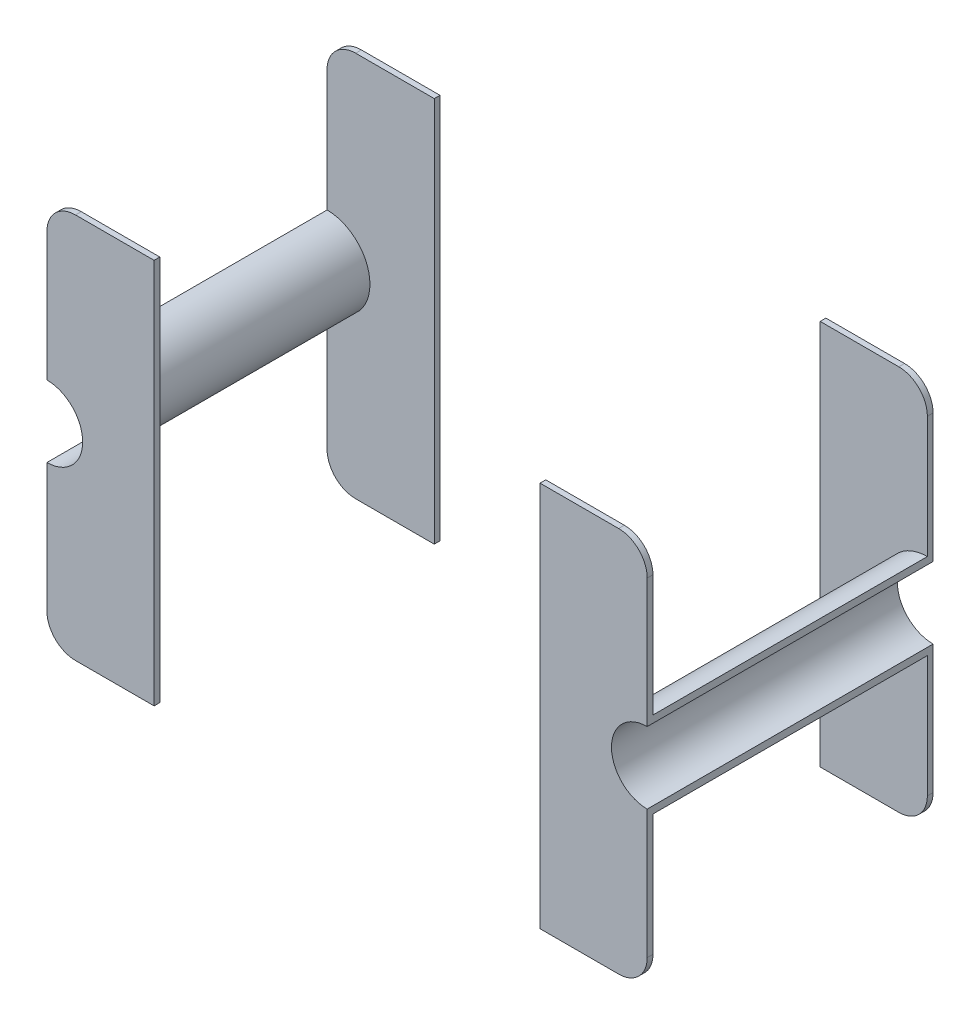
ISO-10303-21;
HEADER;
FILE_DESCRIPTION(('STEP AP214'),'2;1');
FILE_NAME('part.step','',(''),(''),'','','');
FILE_SCHEMA(('AUTOMOTIVE_DESIGN { 1 0 10303 214 1 1 1 1 }'));
ENDSEC;
DATA;
#1=APPLICATION_CONTEXT('core data for automotive mechanical design processes');
#2=APPLICATION_PROTOCOL_DEFINITION('international standard','automotive_design',2000,#1);
#3=PRODUCT_CONTEXT('',#1,'mechanical');
#4=PRODUCT('Part','Part','',(#3));
#5=PRODUCT_RELATED_PRODUCT_CATEGORY('part','',(#4));
#6=PRODUCT_DEFINITION_FORMATION('','',#4);
#7=PRODUCT_DEFINITION_CONTEXT('part definition',#1,'design');
#8=PRODUCT_DEFINITION('design','',#6,#7);
#9=PRODUCT_DEFINITION_SHAPE('','',#8);
#10=(LENGTH_UNIT() NAMED_UNIT(*) SI_UNIT(.MILLI.,.METRE.));
#11=(NAMED_UNIT(*) PLANE_ANGLE_UNIT() SI_UNIT($,.RADIAN.));
#12=(NAMED_UNIT(*) SI_UNIT($,.STERADIAN.) SOLID_ANGLE_UNIT());
#13=UNCERTAINTY_MEASURE_WITH_UNIT(LENGTH_MEASURE(1.E-05),#10,'distance_accuracy_value','');
#14=(GEOMETRIC_REPRESENTATION_CONTEXT(3) GLOBAL_UNCERTAINTY_ASSIGNED_CONTEXT((#13)) GLOBAL_UNIT_ASSIGNED_CONTEXT((#10,
#11,#12)) REPRESENTATION_CONTEXT('',''));
#15=CARTESIAN_POINT('',(0.,0.,0.));
#16=DIRECTION('',(0.,0.,1.));
#17=DIRECTION('',(1.,0.,0.));
#18=AXIS2_PLACEMENT_3D('',#15,#16,#17);
#19=CARTESIAN_POINT('',(0.,0.,1.));
#20=DIRECTION('',(0.,0.,1.));
#21=DIRECTION('',(1.,0.,0.));
#22=AXIS2_PLACEMENT_3D('',#19,#20,#21);
#23=PLANE('',#22);
#24=DIRECTION('',(0.,1.,0.));
#25=VECTOR('',#24,1.);
#26=CARTESIAN_POINT('',(0.675,0.675,1.));
#27=LINE('',#26,#25);
#28=CARTESIAN_POINT('',(0.675,0.675,1.));
#29=VERTEX_POINT('',#28);
#30=CARTESIAN_POINT('',(0.675,-0.675,1.));
#31=VERTEX_POINT('',#30);
#32=EDGE_CURVE('P0_E201',#29,#31,#27,.F.);
#33=ORIENTED_EDGE('',*,*,#32,.T.);
#34=DIRECTION('',(1.,0.,0.));
#35=VECTOR('',#34,1.);
#36=CARTESIAN_POINT('',(0.,-0.675,1.));
#37=LINE('',#36,#35);
#38=CARTESIAN_POINT('',(0.95,-0.675,1.));
#39=VERTEX_POINT('',#38);
#40=EDGE_CURVE('P0_E114',#31,#39,#37,.T.);
#41=ORIENTED_EDGE('',*,*,#40,.T.);
#42=CARTESIAN_POINT('',(0.95,-0.575,1.));
#43=DIRECTION('',(0.,0.,-1.));
#44=DIRECTION('',(-1.,0.,0.));
#45=AXIS2_PLACEMENT_3D('',#42,#43,#44);
#46=CIRCLE('',#45,0.1);
#47=CARTESIAN_POINT('',(1.05,-0.575,1.));
#48=VERTEX_POINT('',#47);
#49=EDGE_CURVE('P0_E20',#39,#48,#46,.F.);
#50=ORIENTED_EDGE('',*,*,#49,.T.);
#51=DIRECTION('',(0.,1.,0.));
#52=VECTOR('',#51,1.);
#53=CARTESIAN_POINT('',(1.05,0.,1.));
#54=LINE('',#53,#52);
#55=CARTESIAN_POINT('',(1.05,-0.125,1.));
#56=VERTEX_POINT('',#55);
#57=EDGE_CURVE('P0_E119',#48,#56,#54,.T.);
#58=ORIENTED_EDGE('',*,*,#57,.T.);
#59=CARTESIAN_POINT('',(1.05,0.,1.));
#60=DIRECTION('',(0.,0.,1.));
#61=DIRECTION('',(1.,0.,0.));
#62=AXIS2_PLACEMENT_3D('',#59,#60,#61);
#63=CIRCLE('',#62,0.125);
#64=CARTESIAN_POINT('',(1.05,0.125,1.));
#65=VERTEX_POINT('',#64);
#66=EDGE_CURVE('P0_E136',#56,#65,#63,.F.);
#67=ORIENTED_EDGE('',*,*,#66,.T.);
#68=DIRECTION('',(0.,1.,0.));
#69=VECTOR('',#68,1.);
#70=CARTESIAN_POINT('',(1.05,0.,1.));
#71=LINE('',#70,#69);
#72=CARTESIAN_POINT('',(1.05,0.575,1.));
#73=VERTEX_POINT('',#72);
#74=EDGE_CURVE('P0_E138',#65,#73,#71,.T.);
#75=ORIENTED_EDGE('',*,*,#74,.T.);
#76=CARTESIAN_POINT('',(0.95,0.575,1.));
#77=DIRECTION('',(0.,0.,1.));
#78=DIRECTION('',(1.,0.,0.));
#79=AXIS2_PLACEMENT_3D('',#76,#77,#78);
#80=CIRCLE('',#79,0.1);
#81=CARTESIAN_POINT('',(0.95,0.675,1.));
#82=VERTEX_POINT('',#81);
#83=EDGE_CURVE('P0_E171',#73,#82,#80,.T.);
#84=ORIENTED_EDGE('',*,*,#83,.T.);
#85=DIRECTION('',(1.,0.,0.));
#86=VECTOR('',#85,1.);
#87=CARTESIAN_POINT('',(0.,0.675,1.));
#88=LINE('',#87,#86);
#89=EDGE_CURVE('P0_E172',#82,#29,#88,.F.);
#90=ORIENTED_EDGE('',*,*,#89,.T.);
#91=EDGE_LOOP('',(#33,#41,#50,#58,#67,#75,#84,#90));
#92=FACE_BOUND('',#91,.T.);
#93=ADVANCED_FACE('P0_F17',(#92),#23,.T.);
#94=CARTESIAN_POINT('',(0.675,0.675,1.));
#95=DIRECTION('',(1.,0.,0.));
#96=DIRECTION('',(0.,0.,-1.));
#97=AXIS2_PLACEMENT_3D('',#94,#95,#96);
#98=PLANE('',#97);
#99=DIRECTION('',(0.,0.,1.));
#100=VECTOR('',#99,1.);
#101=CARTESIAN_POINT('',(0.675,0.675,-0.25));
#102=LINE('',#101,#100);
#103=CARTESIAN_POINT('',(0.675,0.675,0.98));
#104=VERTEX_POINT('',#103);
#105=EDGE_CURVE('P0_E199',#104,#29,#102,.T.);
#106=ORIENTED_EDGE('',*,*,#105,.F.);
#107=DIRECTION('',(0.,1.,0.));
#108=VECTOR('',#107,1.);
#109=CARTESIAN_POINT('',(0.675,0.675,0.98));
#110=LINE('',#109,#108);
#111=CARTESIAN_POINT('',(0.675,-0.675,0.98));
#112=VERTEX_POINT('',#111);
#113=EDGE_CURVE('P0_E224',#104,#112,#110,.F.);
#114=ORIENTED_EDGE('',*,*,#113,.T.);
#115=DIRECTION('',(0.,0.,-1.));
#116=VECTOR('',#115,1.);
#117=CARTESIAN_POINT('',(0.675,-0.675,-0.25));
#118=LINE('',#117,#116);
#119=EDGE_CURVE('P0_E208',#31,#112,#118,.T.);
#120=ORIENTED_EDGE('',*,*,#119,.F.);
#121=ORIENTED_EDGE('',*,*,#32,.F.);
#122=EDGE_LOOP('',(#106,#114,#120,#121));
#123=FACE_BOUND('',#122,.T.);
#124=ADVANCED_FACE('P0_F204',(#123),#98,.F.);
#125=CARTESIAN_POINT('',(-1.05,-0.675,-0.25));
#126=DIRECTION('',(0.,-1.,0.));
#127=DIRECTION('',(0.,0.,-1.));
#128=AXIS2_PLACEMENT_3D('',#125,#126,#127);
#129=PLANE('',#128);
#130=ORIENTED_EDGE('',*,*,#119,.T.);
#131=DIRECTION('',(1.,0.,0.));
#132=VECTOR('',#131,1.);
#133=CARTESIAN_POINT('',(-1.05,-0.675,0.98));
#134=LINE('',#133,#132);
#135=CARTESIAN_POINT('',(0.95,-0.675,0.98));
#136=VERTEX_POINT('',#135);
#137=EDGE_CURVE('P0_E162',#112,#136,#134,.T.);
#138=ORIENTED_EDGE('',*,*,#137,.T.);
#139=DIRECTION('',(0.,0.,-1.));
#140=VECTOR('',#139,1.);
#141=CARTESIAN_POINT('',(0.95,-0.675,-0.125));
#142=LINE('',#141,#140);
#143=EDGE_CURVE('P0_E165',#39,#136,#142,.T.);
#144=ORIENTED_EDGE('',*,*,#143,.F.);
#145=ORIENTED_EDGE('',*,*,#40,.F.);
#146=EDGE_LOOP('',(#130,#138,#144,#145));
#147=FACE_BOUND('',#146,.T.);
#148=ADVANCED_FACE('P0_F346',(#147),#129,.T.);
#149=CARTESIAN_POINT('',(1.05,0.675,-0.25));
#150=DIRECTION('',(0.,1.,0.));
#151=DIRECTION('',(0.,0.,1.));
#152=AXIS2_PLACEMENT_3D('',#149,#150,#151);
#153=PLANE('',#152);
#154=ORIENTED_EDGE('',*,*,#105,.T.);
#155=ORIENTED_EDGE('',*,*,#89,.F.);
#156=DIRECTION('',(0.,0.,1.));
#157=VECTOR('',#156,1.);
#158=CARTESIAN_POINT('',(0.95,0.675,-0.125));
#159=LINE('',#158,#157);
#160=CARTESIAN_POINT('',(0.95,0.675,0.98));
#161=VERTEX_POINT('',#160);
#162=EDGE_CURVE('P0_E157',#161,#82,#159,.T.);
#163=ORIENTED_EDGE('',*,*,#162,.F.);
#164=DIRECTION('',(1.,0.,0.));
#165=VECTOR('',#164,1.);
#166=CARTESIAN_POINT('',(-1.05,0.675,0.98));
#167=LINE('',#166,#165);
#168=EDGE_CURVE('P0_E226',#161,#104,#167,.F.);
#169=ORIENTED_EDGE('',*,*,#168,.T.);
#170=EDGE_LOOP('',(#154,#155,#163,#169));
#171=FACE_BOUND('',#170,.T.);
#172=ADVANCED_FACE('P0_F197',(#171),#153,.T.);
#173=CARTESIAN_POINT('',(1.05,0.675,0.02));
#174=DIRECTION('',(0.,0.,-1.));
#175=DIRECTION('',(-1.,0.,0.));
#176=AXIS2_PLACEMENT_3D('',#173,#174,#175);
#177=PLANE('',#176);
#178=DIRECTION('',(1.,0.,0.));
#179=VECTOR('',#178,1.);
#180=CARTESIAN_POINT('',(1.05,0.675,0.02));
#181=LINE('',#180,#179);
#182=CARTESIAN_POINT('',(0.675,0.675,0.02));
#183=VERTEX_POINT('',#182);
#184=CARTESIAN_POINT('',(0.95,0.675,0.02));
#185=VERTEX_POINT('',#184);
#186=EDGE_CURVE('P0_E153',#183,#185,#181,.T.);
#187=ORIENTED_EDGE('',*,*,#186,.F.);
#188=DIRECTION('',(0.,1.,0.));
#189=VECTOR('',#188,1.);
#190=CARTESIAN_POINT('',(0.675,-0.675,0.02));
#191=LINE('',#190,#189);
#192=CARTESIAN_POINT('',(0.675,-0.675,0.02));
#193=VERTEX_POINT('',#192);
#194=EDGE_CURVE('P0_E242',#183,#193,#191,.F.);
#195=ORIENTED_EDGE('',*,*,#194,.T.);
#196=DIRECTION('',(-1.,0.,0.));
#197=VECTOR('',#196,1.);
#198=CARTESIAN_POINT('',(1.05,-0.675,0.02));
#199=LINE('',#198,#197);
#200=CARTESIAN_POINT('',(0.95,-0.675,0.02));
#201=VERTEX_POINT('',#200);
#202=EDGE_CURVE('P0_E166',#201,#193,#199,.T.);
#203=ORIENTED_EDGE('',*,*,#202,.F.);
#204=CARTESIAN_POINT('',(0.95,-0.575,0.02));
#205=DIRECTION('',(0.,0.,1.));
#206=DIRECTION('',(1.,0.,0.));
#207=AXIS2_PLACEMENT_3D('',#204,#205,#206);
#208=CIRCLE('',#207,0.1);
#209=CARTESIAN_POINT('',(1.05,-0.575,0.02));
#210=VERTEX_POINT('',#209);
#211=EDGE_CURVE('P0_E167',#210,#201,#208,.F.);
#212=ORIENTED_EDGE('',*,*,#211,.F.);
#213=DIRECTION('',(0.,1.,0.));
#214=VECTOR('',#213,1.);
#215=CARTESIAN_POINT('',(1.05,0.675,0.02));
#216=LINE('',#215,#214);
#217=CARTESIAN_POINT('',(1.05,-0.15,0.02));
#218=VERTEX_POINT('',#217);
#219=EDGE_CURVE('P0_E170',#218,#210,#216,.F.);
#220=ORIENTED_EDGE('',*,*,#219,.F.);
#221=CARTESIAN_POINT('',(1.05,0.,0.0200000000000001));
#222=DIRECTION('',(0.,0.,-1.));
#223=DIRECTION('',(-1.,0.,0.));
#224=AXIS2_PLACEMENT_3D('',#221,#222,#223);
#225=CIRCLE('',#224,0.15);
#226=CARTESIAN_POINT('',(1.05,0.15,0.02));
#227=VERTEX_POINT('',#226);
#228=EDGE_CURVE('P0_E150',#227,#218,#225,.F.);
#229=ORIENTED_EDGE('',*,*,#228,.F.);
#230=DIRECTION('',(0.,1.,0.));
#231=VECTOR('',#230,1.);
#232=CARTESIAN_POINT('',(1.05,0.675,0.02));
#233=LINE('',#232,#231);
#234=CARTESIAN_POINT('',(1.05,0.575,0.02));
#235=VERTEX_POINT('',#234);
#236=EDGE_CURVE('P0_E221',#235,#227,#233,.F.);
#237=ORIENTED_EDGE('',*,*,#236,.F.);
#238=CARTESIAN_POINT('',(0.95,0.575,0.02));
#239=DIRECTION('',(0.,0.,1.));
#240=DIRECTION('',(1.,0.,0.));
#241=AXIS2_PLACEMENT_3D('',#238,#239,#240);
#242=CIRCLE('',#241,0.1);
#243=EDGE_CURVE('P0_E163',#185,#235,#242,.F.);
#244=ORIENTED_EDGE('',*,*,#243,.F.);
#245=EDGE_LOOP('',(#187,#195,#203,#212,#220,#229,#237,#244));
#246=FACE_BOUND('',#245,.T.);
#247=ADVANCED_FACE('P0_F324',(#246),#177,.F.);
#248=CARTESIAN_POINT('',(0.95,-0.575,-0.125));
#249=DIRECTION('',(0.,0.,-1.));
#250=DIRECTION('',(-1.,0.,0.));
#251=AXIS2_PLACEMENT_3D('',#248,#249,#250);
#252=CYLINDRICAL_SURFACE('',#251,0.1);
#253=CARTESIAN_POINT('',(0.95,-0.575,0.98));
#254=DIRECTION('',(0.,0.,-1.));
#255=DIRECTION('',(-1.,0.,0.));
#256=AXIS2_PLACEMENT_3D('',#253,#254,#255);
#257=CIRCLE('',#256,0.1);
#258=CARTESIAN_POINT('',(1.05,-0.575,0.98));
#259=VERTEX_POINT('',#258);
#260=EDGE_CURVE('P0_E126',#136,#259,#257,.F.);
#261=ORIENTED_EDGE('',*,*,#260,.T.);
#262=DIRECTION('',(0.,0.,-1.));
#263=VECTOR('',#262,1.);
#264=CARTESIAN_POINT('',(1.05,-0.575,0.));
#265=LINE('',#264,#263);
#266=EDGE_CURVE('P0_E123',#48,#259,#265,.T.);
#267=ORIENTED_EDGE('',*,*,#266,.F.);
#268=ORIENTED_EDGE('',*,*,#49,.F.);
#269=ORIENTED_EDGE('',*,*,#143,.T.);
#270=EDGE_LOOP('',(#261,#267,#268,#269));
#271=FACE_BOUND('',#270,.T.);
#272=ADVANCED_FACE('P0_F124',(#271),#252,.T.);
#273=CARTESIAN_POINT('',(-1.05,0.675,0.98));
#274=DIRECTION('',(0.,0.,1.));
#275=DIRECTION('',(1.,0.,0.));
#276=AXIS2_PLACEMENT_3D('',#273,#274,#275);
#277=PLANE('',#276);
#278=ORIENTED_EDGE('',*,*,#137,.F.);
#279=ORIENTED_EDGE('',*,*,#113,.F.);
#280=ORIENTED_EDGE('',*,*,#168,.F.);
#281=CARTESIAN_POINT('',(0.95,0.575,0.98));
#282=DIRECTION('',(0.,0.,1.));
#283=DIRECTION('',(1.,0.,0.));
#284=AXIS2_PLACEMENT_3D('',#281,#282,#283);
#285=CIRCLE('',#284,0.1);
#286=CARTESIAN_POINT('',(1.05,0.575,0.98));
#287=VERTEX_POINT('',#286);
#288=EDGE_CURVE('P0_E158',#287,#161,#285,.T.);
#289=ORIENTED_EDGE('',*,*,#288,.F.);
#290=DIRECTION('',(0.,1.,0.));
#291=VECTOR('',#290,1.);
#292=CARTESIAN_POINT('',(1.05,0.675,0.98));
#293=LINE('',#292,#291);
#294=CARTESIAN_POINT('',(1.05,0.15,0.98));
#295=VERTEX_POINT('',#294);
#296=EDGE_CURVE('P0_E185',#295,#287,#293,.T.);
#297=ORIENTED_EDGE('',*,*,#296,.F.);
#298=CARTESIAN_POINT('',(1.05,0.,0.98));
#299=DIRECTION('',(0.,0.,-1.));
#300=DIRECTION('',(-1.,0.,0.));
#301=AXIS2_PLACEMENT_3D('',#298,#299,#300);
#302=CIRCLE('',#301,0.15);
#303=CARTESIAN_POINT('',(1.05,-0.15,0.98));
#304=VERTEX_POINT('',#303);
#305=EDGE_CURVE('P0_E154',#304,#295,#302,.T.);
#306=ORIENTED_EDGE('',*,*,#305,.F.);
#307=DIRECTION('',(0.,1.,0.));
#308=VECTOR('',#307,1.);
#309=CARTESIAN_POINT('',(1.05,-0.675,0.98));
#310=LINE('',#309,#308);
#311=EDGE_CURVE('P0_E129',#259,#304,#310,.T.);
#312=ORIENTED_EDGE('',*,*,#311,.F.);
#313=ORIENTED_EDGE('',*,*,#260,.F.);
#314=EDGE_LOOP('',(#278,#279,#280,#289,#297,#306,#312,#313));
#315=FACE_BOUND('',#314,.T.);
#316=ADVANCED_FACE('P0_F349',(#315),#277,.F.);
#317=CARTESIAN_POINT('',(0.95,0.575,-0.125));
#318=DIRECTION('',(0.,0.,1.));
#319=DIRECTION('',(1.,0.,0.));
#320=AXIS2_PLACEMENT_3D('',#317,#318,#319);
#321=CYLINDRICAL_SURFACE('',#320,0.1);
#322=ORIENTED_EDGE('',*,*,#288,.T.);
#323=ORIENTED_EDGE('',*,*,#162,.T.);
#324=ORIENTED_EDGE('',*,*,#83,.F.);
#325=DIRECTION('',(0.,0.,-1.));
#326=VECTOR('',#325,1.);
#327=CARTESIAN_POINT('',(1.05,0.575,0.));
#328=LINE('',#327,#326);
#329=EDGE_CURVE('P0_E182',#287,#73,#328,.F.);
#330=ORIENTED_EDGE('',*,*,#329,.F.);
#331=EDGE_LOOP('',(#322,#323,#324,#330));
#332=FACE_BOUND('',#331,.T.);
#333=ADVANCED_FACE('P0_F190',(#332),#321,.T.);
#334=CARTESIAN_POINT('',(1.05,0.,1.25));
#335=DIRECTION('',(0.,0.,-1.));
#336=DIRECTION('',(-1.,0.,0.));
#337=AXIS2_PLACEMENT_3D('',#334,#335,#336);
#338=CYLINDRICAL_SURFACE('',#337,0.15);
#339=ORIENTED_EDGE('',*,*,#228,.T.);
#340=DIRECTION('',(0.,0.,-1.));
#341=VECTOR('',#340,1.);
#342=CARTESIAN_POINT('',(1.05,-0.15,0.));
#343=LINE('',#342,#341);
#344=EDGE_CURVE('P0_E247',#304,#218,#343,.T.);
#345=ORIENTED_EDGE('',*,*,#344,.F.);
#346=ORIENTED_EDGE('',*,*,#305,.T.);
#347=DIRECTION('',(0.,0.,-1.));
#348=VECTOR('',#347,1.);
#349=CARTESIAN_POINT('',(1.05,0.15,0.));
#350=LINE('',#349,#348);
#351=EDGE_CURVE('P0_E230',#227,#295,#350,.F.);
#352=ORIENTED_EDGE('',*,*,#351,.F.);
#353=EDGE_LOOP('',(#339,#345,#346,#352));
#354=FACE_BOUND('',#353,.T.);
#355=ADVANCED_FACE('P0_F353',(#354),#338,.T.);
#356=CARTESIAN_POINT('',(1.05,0.675,0.));
#357=DIRECTION('',(0.,1.,0.));
#358=DIRECTION('',(0.,0.,1.));
#359=AXIS2_PLACEMENT_3D('',#356,#357,#358);
#360=PLANE('',#359);
#361=DIRECTION('',(0.,0.,-1.));
#362=VECTOR('',#361,1.);
#363=CARTESIAN_POINT('',(0.675,0.675,0.));
#364=LINE('',#363,#362);
#365=CARTESIAN_POINT('',(0.675,0.675,0.));
#366=VERTEX_POINT('',#365);
#367=EDGE_CURVE('P0_E246',#366,#183,#364,.F.);
#368=ORIENTED_EDGE('',*,*,#367,.T.);
#369=ORIENTED_EDGE('',*,*,#186,.T.);
#370=DIRECTION('',(0.,0.,1.));
#371=VECTOR('',#370,1.);
#372=CARTESIAN_POINT('',(0.95,0.675,0.));
#373=LINE('',#372,#371);
#374=CARTESIAN_POINT('',(0.95,0.675,0.));
#375=VERTEX_POINT('',#374);
#376=EDGE_CURVE('P0_E232',#375,#185,#373,.T.);
#377=ORIENTED_EDGE('',*,*,#376,.F.);
#378=DIRECTION('',(1.,0.,0.));
#379=VECTOR('',#378,1.);
#380=CARTESIAN_POINT('',(0.,0.675,0.));
#381=LINE('',#380,#379);
#382=EDGE_CURVE('P0_E273',#375,#366,#381,.F.);
#383=ORIENTED_EDGE('',*,*,#382,.T.);
#384=EDGE_LOOP('',(#368,#369,#377,#383));
#385=FACE_BOUND('',#384,.T.);
#386=ADVANCED_FACE('P0_F328',(#385),#360,.T.);
#387=CARTESIAN_POINT('',(0.675,-0.675,0.));
#388=DIRECTION('',(1.,0.,0.));
#389=DIRECTION('',(0.,0.,-1.));
#390=AXIS2_PLACEMENT_3D('',#387,#388,#389);
#391=PLANE('',#390);
#392=DIRECTION('',(0.,0.,-1.));
#393=VECTOR('',#392,1.);
#394=CARTESIAN_POINT('',(0.675,-0.675,0.));
#395=LINE('',#394,#393);
#396=CARTESIAN_POINT('',(0.675,-0.675,0.));
#397=VERTEX_POINT('',#396);
#398=EDGE_CURVE('P0_E245',#193,#397,#395,.T.);
#399=ORIENTED_EDGE('',*,*,#398,.F.);
#400=ORIENTED_EDGE('',*,*,#194,.F.);
#401=ORIENTED_EDGE('',*,*,#367,.F.);
#402=DIRECTION('',(0.,1.,0.));
#403=VECTOR('',#402,1.);
#404=CARTESIAN_POINT('',(0.675,0.,0.));
#405=LINE('',#404,#403);
#406=EDGE_CURVE('P0_E270',#366,#397,#405,.F.);
#407=ORIENTED_EDGE('',*,*,#406,.T.);
#408=EDGE_LOOP('',(#399,#400,#401,#407));
#409=FACE_BOUND('',#408,.T.);
#410=ADVANCED_FACE('P0_F334',(#409),#391,.F.);
#411=CARTESIAN_POINT('',(-1.05,-0.675,0.));
#412=DIRECTION('',(0.,-1.,0.));
#413=DIRECTION('',(0.,0.,-1.));
#414=AXIS2_PLACEMENT_3D('',#411,#412,#413);
#415=PLANE('',#414);
#416=ORIENTED_EDGE('',*,*,#398,.T.);
#417=DIRECTION('',(1.,0.,0.));
#418=VECTOR('',#417,1.);
#419=CARTESIAN_POINT('',(0.,-0.675,0.));
#420=LINE('',#419,#418);
#421=CARTESIAN_POINT('',(0.95,-0.675,0.));
#422=VERTEX_POINT('',#421);
#423=EDGE_CURVE('P0_E149',#397,#422,#420,.T.);
#424=ORIENTED_EDGE('',*,*,#423,.T.);
#425=DIRECTION('',(0.,0.,1.));
#426=VECTOR('',#425,1.);
#427=CARTESIAN_POINT('',(0.95,-0.675,0.));
#428=LINE('',#427,#426);
#429=EDGE_CURVE('P0_E130',#201,#422,#428,.F.);
#430=ORIENTED_EDGE('',*,*,#429,.F.);
#431=ORIENTED_EDGE('',*,*,#202,.T.);
#432=EDGE_LOOP('',(#416,#424,#430,#431));
#433=FACE_BOUND('',#432,.T.);
#434=ADVANCED_FACE('P0_F341',(#433),#415,.T.);
#435=CARTESIAN_POINT('',(0.95,-0.575,0.));
#436=DIRECTION('',(0.,0.,1.));
#437=DIRECTION('',(1.,0.,0.));
#438=AXIS2_PLACEMENT_3D('',#435,#436,#437);
#439=CYLINDRICAL_SURFACE('',#438,0.1);
#440=ORIENTED_EDGE('',*,*,#211,.T.);
#441=ORIENTED_EDGE('',*,*,#429,.T.);
#442=CARTESIAN_POINT('',(0.95,-0.575,0.));
#443=DIRECTION('',(0.,0.,1.));
#444=DIRECTION('',(1.,0.,0.));
#445=AXIS2_PLACEMENT_3D('',#442,#443,#444);
#446=CIRCLE('',#445,0.1);
#447=CARTESIAN_POINT('',(1.05,-0.575,0.));
#448=VERTEX_POINT('',#447);
#449=EDGE_CURVE('P0_E146',#422,#448,#446,.T.);
#450=ORIENTED_EDGE('',*,*,#449,.T.);
#451=DIRECTION('',(0.,0.,-1.));
#452=VECTOR('',#451,1.);
#453=CARTESIAN_POINT('',(1.05,-0.575,0.));
#454=LINE('',#453,#452);
#455=EDGE_CURVE('P0_E250',#210,#448,#454,.T.);
#456=ORIENTED_EDGE('',*,*,#455,.F.);
#457=EDGE_LOOP('',(#440,#441,#450,#456));
#458=FACE_BOUND('',#457,.T.);
#459=ADVANCED_FACE('P0_F311',(#458),#439,.T.);
#460=CARTESIAN_POINT('',(1.05,-0.675,0.));
#461=DIRECTION('',(1.,0.,0.));
#462=DIRECTION('',(0.,0.,-1.));
#463=AXIS2_PLACEMENT_3D('',#460,#461,#462);
#464=PLANE('',#463);
#465=DIRECTION('',(0.,0.,1.));
#466=VECTOR('',#465,1.);
#467=CARTESIAN_POINT('',(1.05,-0.125,1.25));
#468=LINE('',#467,#466);
#469=CARTESIAN_POINT('',(1.05,-0.125,0.));
#470=VERTEX_POINT('',#469);
#471=EDGE_CURVE('P0_E134',#470,#56,#468,.T.);
#472=ORIENTED_EDGE('',*,*,#471,.T.);
#473=ORIENTED_EDGE('',*,*,#57,.F.);
#474=ORIENTED_EDGE('',*,*,#266,.T.);
#475=ORIENTED_EDGE('',*,*,#311,.T.);
#476=ORIENTED_EDGE('',*,*,#344,.T.);
#477=ORIENTED_EDGE('',*,*,#219,.T.);
#478=ORIENTED_EDGE('',*,*,#455,.T.);
#479=DIRECTION('',(0.,1.,0.));
#480=VECTOR('',#479,1.);
#481=CARTESIAN_POINT('',(1.05,0.,0.));
#482=LINE('',#481,#480);
#483=EDGE_CURVE('P0_E145',#448,#470,#482,.T.);
#484=ORIENTED_EDGE('',*,*,#483,.T.);
#485=EDGE_LOOP('',(#472,#473,#474,#475,#476,#477,#478,#484));
#486=FACE_BOUND('',#485,.T.);
#487=ADVANCED_FACE('P0_F132',(#486),#464,.T.);
#488=CARTESIAN_POINT('',(1.05,0.,1.25));
#489=DIRECTION('',(0.,0.,1.));
#490=DIRECTION('',(1.,0.,0.));
#491=AXIS2_PLACEMENT_3D('',#488,#489,#490);
#492=CYLINDRICAL_SURFACE('',#491,0.125);
#493=ORIENTED_EDGE('',*,*,#66,.F.);
#494=ORIENTED_EDGE('',*,*,#471,.F.);
#495=CARTESIAN_POINT('',(1.05,0.,0.));
#496=DIRECTION('',(0.,0.,1.));
#497=DIRECTION('',(1.,0.,0.));
#498=AXIS2_PLACEMENT_3D('',#495,#496,#497);
#499=CIRCLE('',#498,0.125);
#500=CARTESIAN_POINT('',(1.05,0.125,0.));
#501=VERTEX_POINT('',#500);
#502=EDGE_CURVE('P0_E142',#470,#501,#499,.F.);
#503=ORIENTED_EDGE('',*,*,#502,.T.);
#504=DIRECTION('',(0.,0.,-1.));
#505=VECTOR('',#504,1.);
#506=CARTESIAN_POINT('',(1.05,0.125,0.));
#507=LINE('',#506,#505);
#508=EDGE_CURVE('P0_E188',#65,#501,#507,.T.);
#509=ORIENTED_EDGE('',*,*,#508,.F.);
#510=EDGE_LOOP('',(#493,#494,#503,#509));
#511=FACE_BOUND('',#510,.T.);
#512=ADVANCED_FACE('P0_F301',(#511),#492,.F.);
#513=CARTESIAN_POINT('',(1.05,-0.675,0.));
#514=DIRECTION('',(1.,0.,0.));
#515=DIRECTION('',(0.,0.,-1.));
#516=AXIS2_PLACEMENT_3D('',#513,#514,#515);
#517=PLANE('',#516);
#518=ORIENTED_EDGE('',*,*,#351,.T.);
#519=ORIENTED_EDGE('',*,*,#296,.T.);
#520=ORIENTED_EDGE('',*,*,#329,.T.);
#521=ORIENTED_EDGE('',*,*,#74,.F.);
#522=ORIENTED_EDGE('',*,*,#508,.T.);
#523=DIRECTION('',(0.,1.,0.));
#524=VECTOR('',#523,1.);
#525=CARTESIAN_POINT('',(1.05,0.,0.));
#526=LINE('',#525,#524);
#527=CARTESIAN_POINT('',(1.05,0.575,0.));
#528=VERTEX_POINT('',#527);
#529=EDGE_CURVE('P0_E26',#501,#528,#526,.T.);
#530=ORIENTED_EDGE('',*,*,#529,.T.);
#531=DIRECTION('',(0.,0.,1.));
#532=VECTOR('',#531,1.);
#533=CARTESIAN_POINT('',(1.05,0.575,0.));
#534=LINE('',#533,#532);
#535=EDGE_CURVE('P0_E34',#235,#528,#534,.F.);
#536=ORIENTED_EDGE('',*,*,#535,.F.);
#537=ORIENTED_EDGE('',*,*,#236,.T.);
#538=EDGE_LOOP('',(#518,#519,#520,#521,#522,#530,#536,#537));
#539=FACE_BOUND('',#538,.T.);
#540=ADVANCED_FACE('P0_F184',(#539),#517,.T.);
#541=CARTESIAN_POINT('',(0.95,0.575,0.));
#542=DIRECTION('',(0.,0.,1.));
#543=DIRECTION('',(1.,0.,0.));
#544=AXIS2_PLACEMENT_3D('',#541,#542,#543);
#545=CYLINDRICAL_SURFACE('',#544,0.1);
#546=ORIENTED_EDGE('',*,*,#243,.T.);
#547=ORIENTED_EDGE('',*,*,#535,.T.);
#548=CARTESIAN_POINT('',(0.95,0.575,0.));
#549=DIRECTION('',(0.,0.,1.));
#550=DIRECTION('',(1.,0.,0.));
#551=AXIS2_PLACEMENT_3D('',#548,#549,#550);
#552=CIRCLE('',#551,0.1);
#553=EDGE_CURVE('P0_E11',#528,#375,#552,.T.);
#554=ORIENTED_EDGE('',*,*,#553,.T.);
#555=ORIENTED_EDGE('',*,*,#376,.T.);
#556=EDGE_LOOP('',(#546,#547,#554,#555));
#557=FACE_BOUND('',#556,.T.);
#558=ADVANCED_FACE('P0_F309',(#557),#545,.T.);
#559=CARTESIAN_POINT('',(0.,0.,0.));
#560=DIRECTION('',(0.,0.,1.));
#561=DIRECTION('',(1.,0.,0.));
#562=AXIS2_PLACEMENT_3D('',#559,#560,#561);
#563=PLANE('',#562);
#564=ORIENTED_EDGE('',*,*,#529,.F.);
#565=ORIENTED_EDGE('',*,*,#502,.F.);
#566=ORIENTED_EDGE('',*,*,#483,.F.);
#567=ORIENTED_EDGE('',*,*,#449,.F.);
#568=ORIENTED_EDGE('',*,*,#423,.F.);
#569=ORIENTED_EDGE('',*,*,#406,.F.);
#570=ORIENTED_EDGE('',*,*,#382,.F.);
#571=ORIENTED_EDGE('',*,*,#553,.F.);
#572=EDGE_LOOP('',(#564,#565,#566,#567,#568,#569,#570,#571));
#573=FACE_BOUND('',#572,.T.);
#574=ADVANCED_FACE('P0_F298',(#573),#563,.F.);
#575=CLOSED_SHELL('',(#93,#124,#148,#172,#247,#272,#316,#333,#355,#386,#410,#434,#459,#487,#512,
#540,#558,#574));
#576=MANIFOLD_SOLID_BREP('P0_B1',#575);
#577=CARTESIAN_POINT('',(0.,0.,0.));
#578=DIRECTION('',(0.,0.,1.));
#579=DIRECTION('',(1.,0.,0.));
#580=AXIS2_PLACEMENT_3D('',#577,#578,#579);
#581=PLANE('',#580);
#582=DIRECTION('',(0.,1.,0.));
#583=VECTOR('',#582,1.);
#584=CARTESIAN_POINT('',(-1.05,0.,0.));
#585=LINE('',#584,#583);
#586=CARTESIAN_POINT('',(-1.05,-0.125,0.));
#587=VERTEX_POINT('',#586);
#588=CARTESIAN_POINT('',(-1.05,-0.575,0.));
#589=VERTEX_POINT('',#588);
#590=EDGE_CURVE('P1_E138',#587,#589,#585,.F.);
#591=ORIENTED_EDGE('',*,*,#590,.F.);
#592=CARTESIAN_POINT('',(-1.05,0.,0.));
#593=DIRECTION('',(0.,0.,1.));
#594=DIRECTION('',(1.,0.,0.));
#595=AXIS2_PLACEMENT_3D('',#592,#593,#594);
#596=CIRCLE('',#595,0.125);
#597=CARTESIAN_POINT('',(-1.05,0.125,0.));
#598=VERTEX_POINT('',#597);
#599=EDGE_CURVE('P1_E136',#598,#587,#596,.F.);
#600=ORIENTED_EDGE('',*,*,#599,.F.);
#601=DIRECTION('',(0.,1.,0.));
#602=VECTOR('',#601,1.);
#603=CARTESIAN_POINT('',(-1.05,0.,0.));
#604=LINE('',#603,#602);
#605=CARTESIAN_POINT('',(-1.05,0.575,0.));
#606=VERTEX_POINT('',#605);
#607=EDGE_CURVE('P1_E124',#606,#598,#604,.F.);
#608=ORIENTED_EDGE('',*,*,#607,.F.);
#609=CARTESIAN_POINT('',(-0.95,0.575,0.));
#610=DIRECTION('',(0.,0.,1.));
#611=DIRECTION('',(1.,0.,0.));
#612=AXIS2_PLACEMENT_3D('',#609,#610,#611);
#613=CIRCLE('',#612,0.1);
#614=CARTESIAN_POINT('',(-0.95,0.675,0.));
#615=VERTEX_POINT('',#614);
#616=EDGE_CURVE('P1_E20',#615,#606,#613,.T.);
#617=ORIENTED_EDGE('',*,*,#616,.F.);
#618=DIRECTION('',(1.,0.,0.));
#619=VECTOR('',#618,1.);
#620=CARTESIAN_POINT('',(0.,0.675,0.));
#621=LINE('',#620,#619);
#622=CARTESIAN_POINT('',(-0.675,0.675,0.));
#623=VERTEX_POINT('',#622);
#624=EDGE_CURVE('P1_E111',#623,#615,#621,.F.);
#625=ORIENTED_EDGE('',*,*,#624,.F.);
#626=DIRECTION('',(0.,1.,0.));
#627=VECTOR('',#626,1.);
#628=CARTESIAN_POINT('',(-0.675,0.675,0.));
#629=LINE('',#628,#627);
#630=CARTESIAN_POINT('',(-0.675,-0.675,0.));
#631=VERTEX_POINT('',#630);
#632=EDGE_CURVE('P1_E183',#623,#631,#629,.F.);
#633=ORIENTED_EDGE('',*,*,#632,.T.);
#634=DIRECTION('',(1.,0.,0.));
#635=VECTOR('',#634,1.);
#636=CARTESIAN_POINT('',(0.,-0.675,0.));
#637=LINE('',#636,#635);
#638=CARTESIAN_POINT('',(-0.95,-0.675,0.));
#639=VERTEX_POINT('',#638);
#640=EDGE_CURVE('P1_E143',#639,#631,#637,.T.);
#641=ORIENTED_EDGE('',*,*,#640,.F.);
#642=CARTESIAN_POINT('',(-0.95,-0.575,0.));
#643=DIRECTION('',(0.,0.,1.));
#644=DIRECTION('',(1.,0.,0.));
#645=AXIS2_PLACEMENT_3D('',#642,#643,#644);
#646=CIRCLE('',#645,0.1);
#647=EDGE_CURVE('P1_E182',#589,#639,#646,.T.);
#648=ORIENTED_EDGE('',*,*,#647,.F.);
#649=EDGE_LOOP('',(#591,#600,#608,#617,#625,#633,#641,#648));
#650=FACE_BOUND('',#649,.T.);
#651=ADVANCED_FACE('P1_F17',(#650),#581,.F.);
#652=CARTESIAN_POINT('',(-0.675,0.675,0.));
#653=DIRECTION('',(-1.,0.,0.));
#654=DIRECTION('',(0.,0.,1.));
#655=AXIS2_PLACEMENT_3D('',#652,#653,#654);
#656=PLANE('',#655);
#657=DIRECTION('',(0.,0.,1.));
#658=VECTOR('',#657,1.);
#659=CARTESIAN_POINT('',(-0.675,0.675,0.));
#660=LINE('',#659,#658);
#661=CARTESIAN_POINT('',(-0.675,0.675,0.02));
#662=VERTEX_POINT('',#661);
#663=EDGE_CURVE('P1_E190',#662,#623,#660,.F.);
#664=ORIENTED_EDGE('',*,*,#663,.F.);
#665=DIRECTION('',(0.,1.,0.));
#666=VECTOR('',#665,1.);
#667=CARTESIAN_POINT('',(-0.675,0.675,0.02));
#668=LINE('',#667,#666);
#669=CARTESIAN_POINT('',(-0.675,-0.675,0.02));
#670=VERTEX_POINT('',#669);
#671=EDGE_CURVE('P1_E274',#662,#670,#668,.F.);
#672=ORIENTED_EDGE('',*,*,#671,.T.);
#673=DIRECTION('',(0.,0.,-1.));
#674=VECTOR('',#673,1.);
#675=CARTESIAN_POINT('',(-0.675,-0.675,0.));
#676=LINE('',#675,#674);
#677=EDGE_CURVE('P1_E207',#631,#670,#676,.F.);
#678=ORIENTED_EDGE('',*,*,#677,.F.);
#679=ORIENTED_EDGE('',*,*,#632,.F.);
#680=EDGE_LOOP('',(#664,#672,#678,#679));
#681=FACE_BOUND('',#680,.T.);
#682=ADVANCED_FACE('P1_F302',(#681),#656,.F.);
#683=CARTESIAN_POINT('',(1.05,0.675,0.));
#684=DIRECTION('',(0.,1.,0.));
#685=DIRECTION('',(0.,0.,1.));
#686=AXIS2_PLACEMENT_3D('',#683,#684,#685);
#687=PLANE('',#686);
#688=ORIENTED_EDGE('',*,*,#663,.T.);
#689=ORIENTED_EDGE('',*,*,#624,.T.);
#690=DIRECTION('',(0.,0.,1.));
#691=VECTOR('',#690,1.);
#692=CARTESIAN_POINT('',(-0.95,0.675,0.));
#693=LINE('',#692,#691);
#694=CARTESIAN_POINT('',(-0.95,0.675,0.02));
#695=VERTEX_POINT('',#694);
#696=EDGE_CURVE('P1_E121',#695,#615,#693,.F.);
#697=ORIENTED_EDGE('',*,*,#696,.F.);
#698=DIRECTION('',(-1.,0.,0.));
#699=VECTOR('',#698,1.);
#700=CARTESIAN_POINT('',(1.05,0.675,0.02));
#701=LINE('',#700,#699);
#702=EDGE_CURVE('P1_E277',#695,#662,#701,.F.);
#703=ORIENTED_EDGE('',*,*,#702,.T.);
#704=EDGE_LOOP('',(#688,#689,#697,#703));
#705=FACE_BOUND('',#704,.T.);
#706=ADVANCED_FACE('P1_F299',(#705),#687,.T.);
#707=CARTESIAN_POINT('',(-1.05,-0.675,0.));
#708=DIRECTION('',(0.,-1.,0.));
#709=DIRECTION('',(0.,0.,-1.));
#710=AXIS2_PLACEMENT_3D('',#707,#708,#709);
#711=PLANE('',#710);
#712=ORIENTED_EDGE('',*,*,#677,.T.);
#713=DIRECTION('',(-1.,0.,0.));
#714=VECTOR('',#713,1.);
#715=CARTESIAN_POINT('',(1.05,-0.675,0.02));
#716=LINE('',#715,#714);
#717=CARTESIAN_POINT('',(-0.95,-0.675,0.02));
#718=VERTEX_POINT('',#717);
#719=EDGE_CURVE('P1_E270',#670,#718,#716,.T.);
#720=ORIENTED_EDGE('',*,*,#719,.T.);
#721=DIRECTION('',(0.,0.,1.));
#722=VECTOR('',#721,1.);
#723=CARTESIAN_POINT('',(-0.95,-0.675,0.));
#724=LINE('',#723,#722);
#725=EDGE_CURVE('P1_E174',#639,#718,#724,.T.);
#726=ORIENTED_EDGE('',*,*,#725,.F.);
#727=ORIENTED_EDGE('',*,*,#640,.T.);
#728=EDGE_LOOP('',(#712,#720,#726,#727));
#729=FACE_BOUND('',#728,.T.);
#730=ADVANCED_FACE('P1_F206',(#729),#711,.T.);
#731=CARTESIAN_POINT('',(1.05,0.675,0.02));
#732=DIRECTION('',(0.,0.,-1.));
#733=DIRECTION('',(-1.,0.,0.));
#734=AXIS2_PLACEMENT_3D('',#731,#732,#733);
#735=PLANE('',#734);
#736=ORIENTED_EDGE('',*,*,#719,.F.);
#737=ORIENTED_EDGE('',*,*,#671,.F.);
#738=ORIENTED_EDGE('',*,*,#702,.F.);
#739=CARTESIAN_POINT('',(-0.95,0.575,0.02));
#740=DIRECTION('',(0.,0.,1.));
#741=DIRECTION('',(1.,0.,0.));
#742=AXIS2_PLACEMENT_3D('',#739,#740,#741);
#743=CIRCLE('',#742,0.1);
#744=CARTESIAN_POINT('',(-1.05,0.575,0.02));
#745=VERTEX_POINT('',#744);
#746=EDGE_CURVE('P1_E175',#745,#695,#743,.F.);
#747=ORIENTED_EDGE('',*,*,#746,.F.);
#748=DIRECTION('',(0.,1.,0.));
#749=VECTOR('',#748,1.);
#750=CARTESIAN_POINT('',(-1.05,0.675,0.02));
#751=LINE('',#750,#749);
#752=CARTESIAN_POINT('',(-1.05,0.15,0.02));
#753=VERTEX_POINT('',#752);
#754=EDGE_CURVE('P1_E129',#753,#745,#751,.T.);
#755=ORIENTED_EDGE('',*,*,#754,.F.);
#756=CARTESIAN_POINT('',(-1.05,0.,0.0200000000000001));
#757=DIRECTION('',(0.,0.,1.));
#758=DIRECTION('',(1.,0.,0.));
#759=AXIS2_PLACEMENT_3D('',#756,#757,#758);
#760=CIRCLE('',#759,0.15);
#761=CARTESIAN_POINT('',(-1.05,-0.15,0.02));
#762=VERTEX_POINT('',#761);
#763=EDGE_CURVE('P1_E165',#762,#753,#760,.T.);
#764=ORIENTED_EDGE('',*,*,#763,.F.);
#765=DIRECTION('',(0.,1.,0.));
#766=VECTOR('',#765,1.);
#767=CARTESIAN_POINT('',(-1.05,0.675,0.02));
#768=LINE('',#767,#766);
#769=CARTESIAN_POINT('',(-1.05,-0.575,0.02));
#770=VERTEX_POINT('',#769);
#771=EDGE_CURVE('P1_E283',#770,#762,#768,.T.);
#772=ORIENTED_EDGE('',*,*,#771,.F.);
#773=CARTESIAN_POINT('',(-0.95,-0.575,0.02));
#774=DIRECTION('',(0.,0.,1.));
#775=DIRECTION('',(1.,0.,0.));
#776=AXIS2_PLACEMENT_3D('',#773,#774,#775);
#777=CIRCLE('',#776,0.1);
#778=EDGE_CURVE('P1_E171',#718,#770,#777,.F.);
#779=ORIENTED_EDGE('',*,*,#778,.F.);
#780=EDGE_LOOP('',(#736,#737,#738,#747,#755,#764,#772,#779));
#781=FACE_BOUND('',#780,.T.);
#782=ADVANCED_FACE('P1_F304',(#781),#735,.F.);
#783=CARTESIAN_POINT('',(-1.05,0.675,0.98));
#784=DIRECTION('',(0.,0.,1.));
#785=DIRECTION('',(1.,0.,0.));
#786=AXIS2_PLACEMENT_3D('',#783,#784,#785);
#787=PLANE('',#786);
#788=DIRECTION('',(0.,1.,0.));
#789=VECTOR('',#788,1.);
#790=CARTESIAN_POINT('',(-1.05,0.675,0.98));
#791=LINE('',#790,#789);
#792=CARTESIAN_POINT('',(-1.05,-0.15,0.98));
#793=VERTEX_POINT('',#792);
#794=CARTESIAN_POINT('',(-1.05,-0.575,0.98));
#795=VERTEX_POINT('',#794);
#796=EDGE_CURVE('P1_E177',#793,#795,#791,.F.);
#797=ORIENTED_EDGE('',*,*,#796,.F.);
#798=CARTESIAN_POINT('',(-1.05,0.,0.98));
#799=DIRECTION('',(0.,0.,1.));
#800=DIRECTION('',(1.,0.,0.));
#801=AXIS2_PLACEMENT_3D('',#798,#799,#800);
#802=CIRCLE('',#801,0.15);
#803=CARTESIAN_POINT('',(-1.05,0.15,0.98));
#804=VERTEX_POINT('',#803);
#805=EDGE_CURVE('P1_E168',#804,#793,#802,.F.);
#806=ORIENTED_EDGE('',*,*,#805,.F.);
#807=DIRECTION('',(0.,1.,0.));
#808=VECTOR('',#807,1.);
#809=CARTESIAN_POINT('',(-1.05,0.675,0.98));
#810=LINE('',#809,#808);
#811=CARTESIAN_POINT('',(-1.05,0.575,0.98));
#812=VERTEX_POINT('',#811);
#813=EDGE_CURVE('P1_E180',#812,#804,#810,.F.);
#814=ORIENTED_EDGE('',*,*,#813,.F.);
#815=CARTESIAN_POINT('',(-0.95,0.575,0.98));
#816=DIRECTION('',(0.,0.,1.));
#817=DIRECTION('',(1.,0.,0.));
#818=AXIS2_PLACEMENT_3D('',#815,#816,#817);
#819=CIRCLE('',#818,0.1);
#820=CARTESIAN_POINT('',(-0.95,0.675,0.98));
#821=VERTEX_POINT('',#820);
#822=EDGE_CURVE('P1_E178',#821,#812,#819,.T.);
#823=ORIENTED_EDGE('',*,*,#822,.F.);
#824=DIRECTION('',(1.,0.,0.));
#825=VECTOR('',#824,1.);
#826=CARTESIAN_POINT('',(-1.05,0.675,0.98));
#827=LINE('',#826,#825);
#828=CARTESIAN_POINT('',(-0.675,0.675,0.98));
#829=VERTEX_POINT('',#828);
#830=EDGE_CURVE('P1_E181',#829,#821,#827,.F.);
#831=ORIENTED_EDGE('',*,*,#830,.F.);
#832=DIRECTION('',(0.,1.,0.));
#833=VECTOR('',#832,1.);
#834=CARTESIAN_POINT('',(-0.675,-0.675,0.98));
#835=LINE('',#834,#833);
#836=CARTESIAN_POINT('',(-0.675,-0.675,0.98));
#837=VERTEX_POINT('',#836);
#838=EDGE_CURVE('P1_E234',#829,#837,#835,.F.);
#839=ORIENTED_EDGE('',*,*,#838,.T.);
#840=DIRECTION('',(1.,0.,0.));
#841=VECTOR('',#840,1.);
#842=CARTESIAN_POINT('',(-1.05,-0.675,0.98));
#843=LINE('',#842,#841);
#844=CARTESIAN_POINT('',(-0.95,-0.675,0.98));
#845=VERTEX_POINT('',#844);
#846=EDGE_CURVE('P1_E259',#845,#837,#843,.T.);
#847=ORIENTED_EDGE('',*,*,#846,.F.);
#848=CARTESIAN_POINT('',(-0.95,-0.575,0.98));
#849=DIRECTION('',(0.,0.,1.));
#850=DIRECTION('',(1.,0.,0.));
#851=AXIS2_PLACEMENT_3D('',#848,#849,#850);
#852=CIRCLE('',#851,0.1);
#853=EDGE_CURVE('P1_E162',#795,#845,#852,.T.);
#854=ORIENTED_EDGE('',*,*,#853,.F.);
#855=EDGE_LOOP('',(#797,#806,#814,#823,#831,#839,#847,#854));
#856=FACE_BOUND('',#855,.T.);
#857=ADVANCED_FACE('P1_F315',(#856),#787,.F.);
#858=CARTESIAN_POINT('',(-0.95,0.575,0.));
#859=DIRECTION('',(0.,0.,1.));
#860=DIRECTION('',(1.,0.,0.));
#861=AXIS2_PLACEMENT_3D('',#858,#859,#860);
#862=CYLINDRICAL_SURFACE('',#861,0.1);
#863=ORIENTED_EDGE('',*,*,#746,.T.);
#864=ORIENTED_EDGE('',*,*,#696,.T.);
#865=ORIENTED_EDGE('',*,*,#616,.T.);
#866=DIRECTION('',(0.,0.,1.));
#867=VECTOR('',#866,1.);
#868=CARTESIAN_POINT('',(-1.05,0.575,0.));
#869=LINE('',#868,#867);
#870=EDGE_CURVE('P1_E120',#745,#606,#869,.F.);
#871=ORIENTED_EDGE('',*,*,#870,.F.);
#872=EDGE_LOOP('',(#863,#864,#865,#871));
#873=FACE_BOUND('',#872,.T.);
#874=ADVANCED_FACE('P1_F119',(#873),#862,.T.);
#875=CARTESIAN_POINT('',(-0.95,-0.575,0.));
#876=DIRECTION('',(0.,0.,1.));
#877=DIRECTION('',(1.,0.,0.));
#878=AXIS2_PLACEMENT_3D('',#875,#876,#877);
#879=CYLINDRICAL_SURFACE('',#878,0.1);
#880=ORIENTED_EDGE('',*,*,#778,.T.);
#881=DIRECTION('',(0.,0.,1.));
#882=VECTOR('',#881,1.);
#883=CARTESIAN_POINT('',(-1.05,-0.575,0.));
#884=LINE('',#883,#882);
#885=EDGE_CURVE('P1_E196',#589,#770,#884,.T.);
#886=ORIENTED_EDGE('',*,*,#885,.F.);
#887=ORIENTED_EDGE('',*,*,#647,.T.);
#888=ORIENTED_EDGE('',*,*,#725,.T.);
#889=EDGE_LOOP('',(#880,#886,#887,#888));
#890=FACE_BOUND('',#889,.T.);
#891=ADVANCED_FACE('P1_F197',(#890),#879,.T.);
#892=CARTESIAN_POINT('',(-1.05,0.,1.25));
#893=DIRECTION('',(0.,0.,1.));
#894=DIRECTION('',(1.,0.,0.));
#895=AXIS2_PLACEMENT_3D('',#892,#893,#894);
#896=CYLINDRICAL_SURFACE('',#895,0.15);
#897=ORIENTED_EDGE('',*,*,#763,.T.);
#898=DIRECTION('',(0.,0.,1.));
#899=VECTOR('',#898,1.);
#900=CARTESIAN_POINT('',(-1.05,0.15,0.));
#901=LINE('',#900,#899);
#902=EDGE_CURVE('P1_E132',#804,#753,#901,.F.);
#903=ORIENTED_EDGE('',*,*,#902,.F.);
#904=ORIENTED_EDGE('',*,*,#805,.T.);
#905=DIRECTION('',(0.,0.,1.));
#906=VECTOR('',#905,1.);
#907=CARTESIAN_POINT('',(-1.05,-0.15,0.));
#908=LINE('',#907,#906);
#909=EDGE_CURVE('P1_E161',#762,#793,#908,.T.);
#910=ORIENTED_EDGE('',*,*,#909,.F.);
#911=EDGE_LOOP('',(#897,#903,#904,#910));
#912=FACE_BOUND('',#911,.T.);
#913=ADVANCED_FACE('P1_F310',(#912),#896,.T.);
#914=CARTESIAN_POINT('',(-0.95,-0.575,-0.125));
#915=DIRECTION('',(0.,0.,1.));
#916=DIRECTION('',(1.,0.,0.));
#917=AXIS2_PLACEMENT_3D('',#914,#915,#916);
#918=CYLINDRICAL_SURFACE('',#917,0.1);
#919=ORIENTED_EDGE('',*,*,#853,.T.);
#920=DIRECTION('',(0.,0.,-1.));
#921=VECTOR('',#920,1.);
#922=CARTESIAN_POINT('',(-0.95,-0.675,-0.25));
#923=LINE('',#922,#921);
#924=CARTESIAN_POINT('',(-0.95,-0.675,1.));
#925=VERTEX_POINT('',#924);
#926=EDGE_CURVE('P1_E164',#925,#845,#923,.T.);
#927=ORIENTED_EDGE('',*,*,#926,.F.);
#928=CARTESIAN_POINT('',(-0.95,-0.575,1.));
#929=DIRECTION('',(0.,0.,1.));
#930=DIRECTION('',(1.,0.,0.));
#931=AXIS2_PLACEMENT_3D('',#928,#929,#930);
#932=CIRCLE('',#931,0.1);
#933=CARTESIAN_POINT('',(-1.05,-0.575,1.));
#934=VERTEX_POINT('',#933);
#935=EDGE_CURVE('P1_E157',#934,#925,#932,.T.);
#936=ORIENTED_EDGE('',*,*,#935,.F.);
#937=DIRECTION('',(0.,0.,1.));
#938=VECTOR('',#937,1.);
#939=CARTESIAN_POINT('',(-1.05,-0.575,0.));
#940=LINE('',#939,#938);
#941=EDGE_CURVE('P1_E320',#795,#934,#940,.T.);
#942=ORIENTED_EDGE('',*,*,#941,.F.);
#943=EDGE_LOOP('',(#919,#927,#936,#942));
#944=FACE_BOUND('',#943,.T.);
#945=ADVANCED_FACE('P1_F321',(#944),#918,.T.);
#946=CARTESIAN_POINT('',(-1.05,-0.675,-0.25));
#947=DIRECTION('',(0.,-1.,0.));
#948=DIRECTION('',(0.,0.,-1.));
#949=AXIS2_PLACEMENT_3D('',#946,#947,#948);
#950=PLANE('',#949);
#951=DIRECTION('',(0.,0.,1.));
#952=VECTOR('',#951,1.);
#953=CARTESIAN_POINT('',(-0.675,-0.675,1.));
#954=LINE('',#953,#952);
#955=CARTESIAN_POINT('',(-0.675,-0.675,1.));
#956=VERTEX_POINT('',#955);
#957=EDGE_CURVE('P1_E237',#837,#956,#954,.T.);
#958=ORIENTED_EDGE('',*,*,#957,.T.);
#959=DIRECTION('',(1.,0.,0.));
#960=VECTOR('',#959,1.);
#961=CARTESIAN_POINT('',(0.,-0.675,1.));
#962=LINE('',#961,#960);
#963=EDGE_CURVE('P1_E160',#925,#956,#962,.T.);
#964=ORIENTED_EDGE('',*,*,#963,.F.);
#965=ORIENTED_EDGE('',*,*,#926,.T.);
#966=ORIENTED_EDGE('',*,*,#846,.T.);
#967=EDGE_LOOP('',(#958,#964,#965,#966));
#968=FACE_BOUND('',#967,.T.);
#969=ADVANCED_FACE('P1_F332',(#968),#950,.T.);
#970=CARTESIAN_POINT('',(-0.675,-0.675,1.));
#971=DIRECTION('',(-1.,0.,0.));
#972=DIRECTION('',(0.,0.,1.));
#973=AXIS2_PLACEMENT_3D('',#970,#971,#972);
#974=PLANE('',#973);
#975=ORIENTED_EDGE('',*,*,#957,.F.);
#976=ORIENTED_EDGE('',*,*,#838,.F.);
#977=DIRECTION('',(0.,0.,1.));
#978=VECTOR('',#977,1.);
#979=CARTESIAN_POINT('',(-0.675,0.675,-0.25));
#980=LINE('',#979,#978);
#981=CARTESIAN_POINT('',(-0.675,0.675,1.));
#982=VERTEX_POINT('',#981);
#983=EDGE_CURVE('P1_E227',#982,#829,#980,.F.);
#984=ORIENTED_EDGE('',*,*,#983,.F.);
#985=DIRECTION('',(0.,1.,0.));
#986=VECTOR('',#985,1.);
#987=CARTESIAN_POINT('',(-0.675,0.,1.));
#988=LINE('',#987,#986);
#989=EDGE_CURVE('P1_E232',#956,#982,#988,.T.);
#990=ORIENTED_EDGE('',*,*,#989,.F.);
#991=EDGE_LOOP('',(#975,#976,#984,#990));
#992=FACE_BOUND('',#991,.T.);
#993=ADVANCED_FACE('P1_F230',(#992),#974,.F.);
#994=CARTESIAN_POINT('',(1.05,0.675,-0.25));
#995=DIRECTION('',(0.,1.,0.));
#996=DIRECTION('',(0.,0.,1.));
#997=AXIS2_PLACEMENT_3D('',#994,#995,#996);
#998=PLANE('',#997);
#999=ORIENTED_EDGE('',*,*,#983,.T.);
#1000=ORIENTED_EDGE('',*,*,#830,.T.);
#1001=DIRECTION('',(0.,0.,1.));
#1002=VECTOR('',#1001,1.);
#1003=CARTESIAN_POINT('',(-0.95,0.675,-0.125));
#1004=LINE('',#1003,#1002);
#1005=CARTESIAN_POINT('',(-0.95,0.675,1.));
#1006=VERTEX_POINT('',#1005);
#1007=EDGE_CURVE('P1_E236',#1006,#821,#1004,.F.);
#1008=ORIENTED_EDGE('',*,*,#1007,.F.);
#1009=DIRECTION('',(1.,0.,0.));
#1010=VECTOR('',#1009,1.);
#1011=CARTESIAN_POINT('',(0.,0.675,1.));
#1012=LINE('',#1011,#1010);
#1013=EDGE_CURVE('P1_E156',#982,#1006,#1012,.F.);
#1014=ORIENTED_EDGE('',*,*,#1013,.F.);
#1015=EDGE_LOOP('',(#999,#1000,#1008,#1014));
#1016=FACE_BOUND('',#1015,.T.);
#1017=ADVANCED_FACE('P1_F240',(#1016),#998,.T.);
#1018=CARTESIAN_POINT('',(-0.95,0.575,-0.125));
#1019=DIRECTION('',(0.,0.,1.));
#1020=DIRECTION('',(1.,0.,0.));
#1021=AXIS2_PLACEMENT_3D('',#1018,#1019,#1020);
#1022=CYLINDRICAL_SURFACE('',#1021,0.1);
#1023=ORIENTED_EDGE('',*,*,#822,.T.);
#1024=DIRECTION('',(0.,0.,1.));
#1025=VECTOR('',#1024,1.);
#1026=CARTESIAN_POINT('',(-1.05,0.575,0.));
#1027=LINE('',#1026,#1025);
#1028=CARTESIAN_POINT('',(-1.05,0.575,1.));
#1029=VERTEX_POINT('',#1028);
#1030=EDGE_CURVE('P1_E287',#1029,#812,#1027,.F.);
#1031=ORIENTED_EDGE('',*,*,#1030,.F.);
#1032=CARTESIAN_POINT('',(-0.95,0.575,1.));
#1033=DIRECTION('',(0.,0.,1.));
#1034=DIRECTION('',(1.,0.,0.));
#1035=AXIS2_PLACEMENT_3D('',#1032,#1033,#1034);
#1036=CIRCLE('',#1035,0.1);
#1037=EDGE_CURVE('P1_E153',#1006,#1029,#1036,.T.);
#1038=ORIENTED_EDGE('',*,*,#1037,.F.);
#1039=ORIENTED_EDGE('',*,*,#1007,.T.);
#1040=EDGE_LOOP('',(#1023,#1031,#1038,#1039));
#1041=FACE_BOUND('',#1040,.T.);
#1042=ADVANCED_FACE('P1_F330',(#1041),#1022,.T.);
#1043=CARTESIAN_POINT('',(-1.05,0.675,0.));
#1044=DIRECTION('',(-1.,0.,0.));
#1045=DIRECTION('',(0.,0.,1.));
#1046=AXIS2_PLACEMENT_3D('',#1043,#1044,#1045);
#1047=PLANE('',#1046);
#1048=DIRECTION('',(0.,0.,1.));
#1049=VECTOR('',#1048,1.);
#1050=CARTESIAN_POINT('',(-1.05,0.125,1.25));
#1051=LINE('',#1050,#1049);
#1052=CARTESIAN_POINT('',(-1.05,0.125,1.));
#1053=VERTEX_POINT('',#1052);
#1054=EDGE_CURVE('P1_E131',#598,#1053,#1051,.T.);
#1055=ORIENTED_EDGE('',*,*,#1054,.T.);
#1056=DIRECTION('',(0.,1.,0.));
#1057=VECTOR('',#1056,1.);
#1058=CARTESIAN_POINT('',(-1.05,0.,1.));
#1059=LINE('',#1058,#1057);
#1060=EDGE_CURVE('P1_E152',#1029,#1053,#1059,.F.);
#1061=ORIENTED_EDGE('',*,*,#1060,.F.);
#1062=ORIENTED_EDGE('',*,*,#1030,.T.);
#1063=ORIENTED_EDGE('',*,*,#813,.T.);
#1064=ORIENTED_EDGE('',*,*,#902,.T.);
#1065=ORIENTED_EDGE('',*,*,#754,.T.);
#1066=ORIENTED_EDGE('',*,*,#870,.T.);
#1067=ORIENTED_EDGE('',*,*,#607,.T.);
#1068=EDGE_LOOP('',(#1055,#1061,#1062,#1063,#1064,#1065,#1066,#1067));
#1069=FACE_BOUND('',#1068,.T.);
#1070=ADVANCED_FACE('P1_F126',(#1069),#1047,.T.);
#1071=CARTESIAN_POINT('',(-1.05,0.,1.25));
#1072=DIRECTION('',(0.,0.,1.));
#1073=DIRECTION('',(1.,0.,0.));
#1074=AXIS2_PLACEMENT_3D('',#1071,#1072,#1073);
#1075=CYLINDRICAL_SURFACE('',#1074,0.125);
#1076=CARTESIAN_POINT('',(-1.05,0.,1.));
#1077=DIRECTION('',(0.,0.,1.));
#1078=DIRECTION('',(1.,0.,0.));
#1079=AXIS2_PLACEMENT_3D('',#1076,#1077,#1078);
#1080=CIRCLE('',#1079,0.125);
#1081=CARTESIAN_POINT('',(-1.05,-0.125,1.));
#1082=VERTEX_POINT('',#1081);
#1083=EDGE_CURVE('P1_E26',#1053,#1082,#1080,.F.);
#1084=ORIENTED_EDGE('',*,*,#1083,.F.);
#1085=ORIENTED_EDGE('',*,*,#1054,.F.);
#1086=ORIENTED_EDGE('',*,*,#599,.T.);
#1087=DIRECTION('',(0.,0.,1.));
#1088=VECTOR('',#1087,1.);
#1089=CARTESIAN_POINT('',(-1.05,-0.125,0.));
#1090=LINE('',#1089,#1088);
#1091=EDGE_CURVE('P1_E35',#1082,#587,#1090,.F.);
#1092=ORIENTED_EDGE('',*,*,#1091,.F.);
#1093=EDGE_LOOP('',(#1084,#1085,#1086,#1092));
#1094=FACE_BOUND('',#1093,.T.);
#1095=ADVANCED_FACE('P1_F335',(#1094),#1075,.F.);
#1096=CARTESIAN_POINT('',(-1.05,0.675,0.));
#1097=DIRECTION('',(-1.,0.,0.));
#1098=DIRECTION('',(0.,0.,1.));
#1099=AXIS2_PLACEMENT_3D('',#1096,#1097,#1098);
#1100=PLANE('',#1099);
#1101=ORIENTED_EDGE('',*,*,#909,.T.);
#1102=ORIENTED_EDGE('',*,*,#796,.T.);
#1103=ORIENTED_EDGE('',*,*,#941,.T.);
#1104=DIRECTION('',(0.,1.,0.));
#1105=VECTOR('',#1104,1.);
#1106=CARTESIAN_POINT('',(-1.05,0.,1.));
#1107=LINE('',#1106,#1105);
#1108=EDGE_CURVE('P1_E11',#1082,#934,#1107,.F.);
#1109=ORIENTED_EDGE('',*,*,#1108,.F.);
#1110=ORIENTED_EDGE('',*,*,#1091,.T.);
#1111=ORIENTED_EDGE('',*,*,#590,.T.);
#1112=ORIENTED_EDGE('',*,*,#885,.T.);
#1113=ORIENTED_EDGE('',*,*,#771,.T.);
#1114=EDGE_LOOP('',(#1101,#1102,#1103,#1109,#1110,#1111,#1112,#1113));
#1115=FACE_BOUND('',#1114,.T.);
#1116=ADVANCED_FACE('P1_F195',(#1115),#1100,.T.);
#1117=CARTESIAN_POINT('',(0.,0.,1.));
#1118=DIRECTION('',(0.,0.,1.));
#1119=DIRECTION('',(1.,0.,0.));
#1120=AXIS2_PLACEMENT_3D('',#1117,#1118,#1119);
#1121=PLANE('',#1120);
#1122=ORIENTED_EDGE('',*,*,#1083,.T.);
#1123=ORIENTED_EDGE('',*,*,#1108,.T.);
#1124=ORIENTED_EDGE('',*,*,#935,.T.);
#1125=ORIENTED_EDGE('',*,*,#963,.T.);
#1126=ORIENTED_EDGE('',*,*,#989,.T.);
#1127=ORIENTED_EDGE('',*,*,#1013,.T.);
#1128=ORIENTED_EDGE('',*,*,#1037,.T.);
#1129=ORIENTED_EDGE('',*,*,#1060,.T.);
#1130=EDGE_LOOP('',(#1122,#1123,#1124,#1125,#1126,#1127,#1128,#1129));
#1131=FACE_BOUND('',#1130,.T.);
#1132=ADVANCED_FACE('P1_F245',(#1131),#1121,.T.);
#1133=CLOSED_SHELL('',(#651,#682,#706,#730,#782,#857,#874,#891,#913,#945,#969,#993,#1017,#1042,
#1070,#1095,#1116,#1132));
#1134=MANIFOLD_SOLID_BREP('P1_B1',#1133);
#1135=ADVANCED_BREP_SHAPE_REPRESENTATION('',(#18,#576,#1134),#14);
#1136=SHAPE_DEFINITION_REPRESENTATION(#9,#1135);
ENDSEC;
END-ISO-10303-21;
